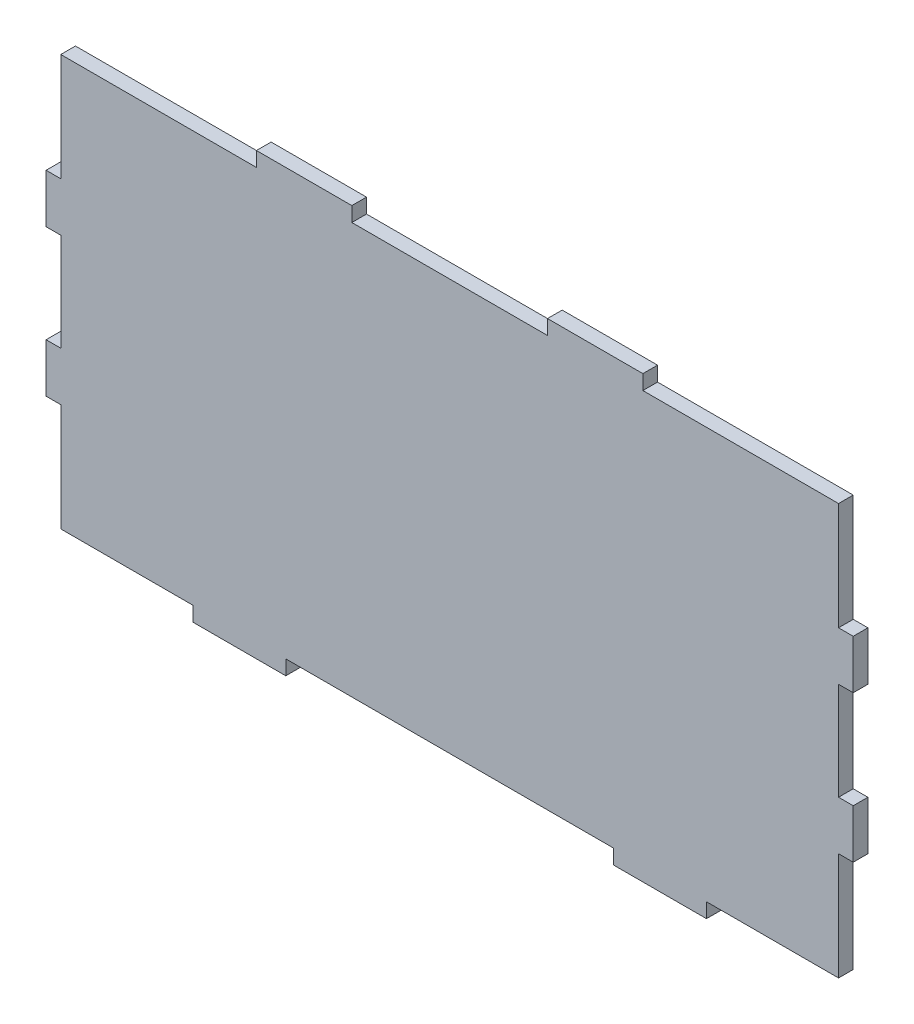
ISO-10303-21;
HEADER;
FILE_DESCRIPTION(('STEP AP214'),'2;1');
FILE_NAME('part.step','',(''),(''),'','','');
FILE_SCHEMA(('AUTOMOTIVE_DESIGN { 1 0 10303 214 1 1 1 1 }'));
ENDSEC;
DATA;
#1=APPLICATION_CONTEXT('core data for automotive mechanical design processes');
#2=APPLICATION_PROTOCOL_DEFINITION('international standard','automotive_design',2000,#1);
#3=PRODUCT_CONTEXT('',#1,'mechanical');
#4=PRODUCT('Part','Part','',(#3));
#5=PRODUCT_RELATED_PRODUCT_CATEGORY('part','',(#4));
#6=PRODUCT_DEFINITION_FORMATION('','',#4);
#7=PRODUCT_DEFINITION_CONTEXT('part definition',#1,'design');
#8=PRODUCT_DEFINITION('design','',#6,#7);
#9=PRODUCT_DEFINITION_SHAPE('','',#8);
#10=(LENGTH_UNIT() NAMED_UNIT(*) SI_UNIT(.MILLI.,.METRE.));
#11=(NAMED_UNIT(*) PLANE_ANGLE_UNIT() SI_UNIT($,.RADIAN.));
#12=(NAMED_UNIT(*) SI_UNIT($,.STERADIAN.) SOLID_ANGLE_UNIT());
#13=UNCERTAINTY_MEASURE_WITH_UNIT(LENGTH_MEASURE(1.E-05),#10,'distance_accuracy_value','');
#14=(GEOMETRIC_REPRESENTATION_CONTEXT(3) GLOBAL_UNCERTAINTY_ASSIGNED_CONTEXT((#13)) GLOBAL_UNIT_ASSIGNED_CONTEXT((#10,
#11,#12)) REPRESENTATION_CONTEXT('',''));
#15=CARTESIAN_POINT('',(0.,0.,0.));
#16=DIRECTION('',(0.,0.,1.));
#17=DIRECTION('',(1.,0.,0.));
#18=AXIS2_PLACEMENT_3D('',#15,#16,#17);
#19=CARTESIAN_POINT('',(0.,0.,6.));
#20=DIRECTION('',(0.,1.,0.));
#21=DIRECTION('',(-1.,0.,0.));
#22=AXIS2_PLACEMENT_3D('',#19,#20,#21);
#23=PLANE('',#22);
#24=DIRECTION('',(1.,0.,0.));
#25=VECTOR('',#24,1.);
#26=CARTESIAN_POINT('',(0.,0.,0.));
#27=LINE('',#26,#25);
#28=CARTESIAN_POINT('',(-270.,0.,0.));
#29=VERTEX_POINT('',#28);
#30=CARTESIAN_POINT('',(-232.,0.,0.));
#31=VERTEX_POINT('',#30);
#32=EDGE_CURVE('E37',#29,#31,#27,.T.);
#33=ORIENTED_EDGE('',*,*,#32,.T.);
#34=DIRECTION('',(0.,0.,1.));
#35=VECTOR('',#34,1.);
#36=CARTESIAN_POINT('',(-232.,0.,0.));
#37=LINE('',#36,#35);
#38=CARTESIAN_POINT('',(-232.,0.,6.));
#39=VERTEX_POINT('',#38);
#40=EDGE_CURVE('E268',#31,#39,#37,.T.);
#41=ORIENTED_EDGE('',*,*,#40,.T.);
#42=DIRECTION('',(1.,0.,0.));
#43=VECTOR('',#42,1.);
#44=CARTESIAN_POINT('',(0.,0.,6.));
#45=LINE('',#44,#43);
#46=CARTESIAN_POINT('',(-270.,0.,6.));
#47=VERTEX_POINT('',#46);
#48=EDGE_CURVE('E11',#47,#39,#45,.T.);
#49=ORIENTED_EDGE('',*,*,#48,.F.);
#50=DIRECTION('',(0.,0.,1.));
#51=VECTOR('',#50,1.);
#52=CARTESIAN_POINT('',(-270.,0.,0.));
#53=LINE('',#52,#51);
#54=EDGE_CURVE('E288',#29,#47,#53,.T.);
#55=ORIENTED_EDGE('',*,*,#54,.F.);
#56=EDGE_LOOP('',(#33,#41,#49,#55));
#57=FACE_BOUND('',#56,.T.);
#58=ADVANCED_FACE('F33',(#57),#23,.F.);
#59=CARTESIAN_POINT('',(0.,180.,6.));
#60=DIRECTION('',(0.,-1.,0.));
#61=DIRECTION('',(1.,0.,0.));
#62=AXIS2_PLACEMENT_3D('',#59,#60,#61);
#63=PLANE('',#62);
#64=DIRECTION('',(-1.,0.,0.));
#65=VECTOR('',#64,1.);
#66=CARTESIAN_POINT('',(0.,180.,6.));
#67=LINE('',#66,#65);
#68=CARTESIAN_POINT('',(-205.,180.,6.));
#69=VERTEX_POINT('',#68);
#70=CARTESIAN_POINT('',(-244.,180.,6.));
#71=VERTEX_POINT('',#70);
#72=EDGE_CURVE('E320',#69,#71,#67,.T.);
#73=ORIENTED_EDGE('',*,*,#72,.F.);
#74=DIRECTION('',(0.,0.,1.));
#75=VECTOR('',#74,1.);
#76=CARTESIAN_POINT('',(-205.,180.,0.));
#77=LINE('',#76,#75);
#78=CARTESIAN_POINT('',(-205.,180.,0.));
#79=VERTEX_POINT('',#78);
#80=EDGE_CURVE('E504',#79,#69,#77,.T.);
#81=ORIENTED_EDGE('',*,*,#80,.F.);
#82=DIRECTION('',(-1.,0.,0.));
#83=VECTOR('',#82,1.);
#84=CARTESIAN_POINT('',(0.,180.,0.));
#85=LINE('',#84,#83);
#86=CARTESIAN_POINT('',(-244.,180.,0.));
#87=VERTEX_POINT('',#86);
#88=EDGE_CURVE('E309',#79,#87,#85,.T.);
#89=ORIENTED_EDGE('',*,*,#88,.T.);
#90=DIRECTION('',(0.,0.,1.));
#91=VECTOR('',#90,1.);
#92=CARTESIAN_POINT('',(-244.,180.,0.));
#93=LINE('',#92,#91);
#94=EDGE_CURVE('E332',#87,#71,#93,.T.);
#95=ORIENTED_EDGE('',*,*,#94,.T.);
#96=EDGE_LOOP('',(#73,#81,#89,#95));
#97=FACE_BOUND('',#96,.T.);
#98=ADVANCED_FACE('F624',(#97),#63,.F.);
#99=CARTESIAN_POINT('',(0.,0.,6.));
#100=DIRECTION('',(-1.,0.,0.));
#101=DIRECTION('',(0.,0.,1.));
#102=AXIS2_PLACEMENT_3D('',#99,#100,#101);
#103=PLANE('',#102);
#104=DIRECTION('',(0.,1.,0.));
#105=VECTOR('',#104,1.);
#106=CARTESIAN_POINT('',(0.,0.,0.));
#107=LINE('',#106,#105);
#108=CARTESIAN_POINT('',(0.,50.,0.));
#109=VERTEX_POINT('',#108);
#110=CARTESIAN_POINT('',(0.,70.,0.));
#111=VERTEX_POINT('',#110);
#112=EDGE_CURVE('E310',#109,#111,#107,.T.);
#113=ORIENTED_EDGE('',*,*,#112,.T.);
#114=DIRECTION('',(0.,0.,1.));
#115=VECTOR('',#114,1.);
#116=CARTESIAN_POINT('',(0.,70.,0.));
#117=LINE('',#116,#115);
#118=CARTESIAN_POINT('',(0.,70.,6.));
#119=VERTEX_POINT('',#118);
#120=EDGE_CURVE('E475',#111,#119,#117,.T.);
#121=ORIENTED_EDGE('',*,*,#120,.T.);
#122=DIRECTION('',(0.,1.,0.));
#123=VECTOR('',#122,1.);
#124=CARTESIAN_POINT('',(0.,0.,6.));
#125=LINE('',#124,#123);
#126=CARTESIAN_POINT('',(0.,50.,6.));
#127=VERTEX_POINT('',#126);
#128=EDGE_CURVE('E291',#127,#119,#125,.T.);
#129=ORIENTED_EDGE('',*,*,#128,.F.);
#130=DIRECTION('',(0.,0.,1.));
#131=VECTOR('',#130,1.);
#132=CARTESIAN_POINT('',(0.,50.,0.));
#133=LINE('',#132,#131);
#134=EDGE_CURVE('E397',#109,#127,#133,.T.);
#135=ORIENTED_EDGE('',*,*,#134,.F.);
#136=EDGE_LOOP('',(#113,#121,#129,#135));
#137=FACE_BOUND('',#136,.T.);
#138=ADVANCED_FACE('F574',(#137),#103,.F.);
#139=CARTESIAN_POINT('',(-330.,0.,6.));
#140=DIRECTION('',(1.,0.,0.));
#141=DIRECTION('',(0.,0.,-1.));
#142=AXIS2_PLACEMENT_3D('',#139,#140,#141);
#143=PLANE('',#142);
#144=DIRECTION('',(0.,-1.,0.));
#145=VECTOR('',#144,1.);
#146=CARTESIAN_POINT('',(-330.,0.,0.));
#147=LINE('',#146,#145);
#148=CARTESIAN_POINT('',(-330.,130.,0.));
#149=VERTEX_POINT('',#148);
#150=CARTESIAN_POINT('',(-330.,110.,0.));
#151=VERTEX_POINT('',#150);
#152=EDGE_CURVE('E293',#149,#151,#147,.T.);
#153=ORIENTED_EDGE('',*,*,#152,.T.);
#154=DIRECTION('',(0.,0.,1.));
#155=VECTOR('',#154,1.);
#156=CARTESIAN_POINT('',(-330.,110.,0.));
#157=LINE('',#156,#155);
#158=CARTESIAN_POINT('',(-330.,110.,6.));
#159=VERTEX_POINT('',#158);
#160=EDGE_CURVE('E415',#151,#159,#157,.T.);
#161=ORIENTED_EDGE('',*,*,#160,.T.);
#162=DIRECTION('',(0.,-1.,0.));
#163=VECTOR('',#162,1.);
#164=CARTESIAN_POINT('',(-330.,0.,6.));
#165=LINE('',#164,#163);
#166=CARTESIAN_POINT('',(-330.,130.,6.));
#167=VERTEX_POINT('',#166);
#168=EDGE_CURVE('E314',#167,#159,#165,.T.);
#169=ORIENTED_EDGE('',*,*,#168,.F.);
#170=DIRECTION('',(0.,0.,1.));
#171=VECTOR('',#170,1.);
#172=CARTESIAN_POINT('',(-330.,130.,0.));
#173=LINE('',#172,#171);
#174=EDGE_CURVE('E323',#149,#167,#173,.T.);
#175=ORIENTED_EDGE('',*,*,#174,.F.);
#176=EDGE_LOOP('',(#153,#161,#169,#175));
#177=FACE_BOUND('',#176,.T.);
#178=ADVANCED_FACE('F641',(#177),#143,.F.);
#179=CARTESIAN_POINT('',(0.,110.,6.));
#180=VERTEX_POINT('',#179);
#181=CARTESIAN_POINT('',(0.,130.,6.));
#182=VERTEX_POINT('',#181);
#183=EDGE_CURVE('E289',#180,#182,#125,.T.);
#184=ORIENTED_EDGE('',*,*,#183,.F.);
#185=DIRECTION('',(0.,0.,1.));
#186=VECTOR('',#185,1.);
#187=CARTESIAN_POINT('',(0.,110.,0.));
#188=LINE('',#187,#186);
#189=CARTESIAN_POINT('',(0.,110.,0.));
#190=VERTEX_POINT('',#189);
#191=EDGE_CURVE('E486',#190,#180,#188,.T.);
#192=ORIENTED_EDGE('',*,*,#191,.F.);
#193=CARTESIAN_POINT('',(0.,130.,0.));
#194=VERTEX_POINT('',#193);
#195=EDGE_CURVE('E312',#190,#194,#107,.T.);
#196=ORIENTED_EDGE('',*,*,#195,.T.);
#197=DIRECTION('',(0.,0.,1.));
#198=VECTOR('',#197,1.);
#199=CARTESIAN_POINT('',(0.,130.,0.));
#200=LINE('',#199,#198);
#201=EDGE_CURVE('E443',#194,#182,#200,.T.);
#202=ORIENTED_EDGE('',*,*,#201,.T.);
#203=EDGE_LOOP('',(#184,#192,#196,#202));
#204=FACE_BOUND('',#203,.T.);
#205=ADVANCED_FACE('F35',(#204),#103,.F.);
#206=CARTESIAN_POINT('',(-86.,180.,0.));
#207=VERTEX_POINT('',#206);
#208=CARTESIAN_POINT('',(-125.,180.,0.));
#209=VERTEX_POINT('',#208);
#210=EDGE_CURVE('E305',#207,#209,#85,.T.);
#211=ORIENTED_EDGE('',*,*,#210,.T.);
#212=DIRECTION('',(0.,0.,1.));
#213=VECTOR('',#212,1.);
#214=CARTESIAN_POINT('',(-125.,180.,0.));
#215=LINE('',#214,#213);
#216=CARTESIAN_POINT('',(-125.,180.,6.));
#217=VERTEX_POINT('',#216);
#218=EDGE_CURVE('E516',#209,#217,#215,.T.);
#219=ORIENTED_EDGE('',*,*,#218,.T.);
#220=CARTESIAN_POINT('',(-86.,180.,6.));
#221=VERTEX_POINT('',#220);
#222=EDGE_CURVE('E318',#221,#217,#67,.T.);
#223=ORIENTED_EDGE('',*,*,#222,.F.);
#224=DIRECTION('',(0.,0.,1.));
#225=VECTOR('',#224,1.);
#226=CARTESIAN_POINT('',(-86.,180.,0.));
#227=LINE('',#226,#225);
#228=EDGE_CURVE('E451',#207,#221,#227,.T.);
#229=ORIENTED_EDGE('',*,*,#228,.F.);
#230=EDGE_LOOP('',(#211,#219,#223,#229));
#231=FACE_BOUND('',#230,.T.);
#232=ADVANCED_FACE('F610',(#231),#63,.F.);
#233=CARTESIAN_POINT('',(-330.,70.,6.));
#234=VERTEX_POINT('',#233);
#235=CARTESIAN_POINT('',(-330.,50.,6.));
#236=VERTEX_POINT('',#235);
#237=EDGE_CURVE('E317',#234,#236,#165,.T.);
#238=ORIENTED_EDGE('',*,*,#237,.F.);
#239=DIRECTION('',(0.,0.,1.));
#240=VECTOR('',#239,1.);
#241=CARTESIAN_POINT('',(-330.,70.,0.));
#242=LINE('',#241,#240);
#243=CARTESIAN_POINT('',(-330.,70.,0.));
#244=VERTEX_POINT('',#243);
#245=EDGE_CURVE('E426',#244,#234,#242,.T.);
#246=ORIENTED_EDGE('',*,*,#245,.F.);
#247=CARTESIAN_POINT('',(-330.,50.,0.));
#248=VERTEX_POINT('',#247);
#249=EDGE_CURVE('E300',#244,#248,#147,.T.);
#250=ORIENTED_EDGE('',*,*,#249,.T.);
#251=DIRECTION('',(0.,0.,1.));
#252=VECTOR('',#251,1.);
#253=CARTESIAN_POINT('',(-330.,50.,0.));
#254=LINE('',#253,#252);
#255=EDGE_CURVE('E364',#248,#236,#254,.T.);
#256=ORIENTED_EDGE('',*,*,#255,.T.);
#257=EDGE_LOOP('',(#238,#246,#250,#256));
#258=FACE_BOUND('',#257,.T.);
#259=ADVANCED_FACE('F657',(#258),#143,.F.);
#260=CARTESIAN_POINT('',(-98.,0.,6.));
#261=VERTEX_POINT('',#260);
#262=CARTESIAN_POINT('',(-60.,0.,6.));
#263=VERTEX_POINT('',#262);
#264=EDGE_CURVE('E42',#261,#263,#45,.T.);
#265=ORIENTED_EDGE('',*,*,#264,.F.);
#266=DIRECTION('',(0.,0.,1.));
#267=VECTOR('',#266,1.);
#268=CARTESIAN_POINT('',(-98.,0.,0.));
#269=LINE('',#268,#267);
#270=CARTESIAN_POINT('',(-98.,0.,0.));
#271=VERTEX_POINT('',#270);
#272=EDGE_CURVE('E277',#271,#261,#269,.T.);
#273=ORIENTED_EDGE('',*,*,#272,.F.);
#274=CARTESIAN_POINT('',(-60.,0.,0.));
#275=VERTEX_POINT('',#274);
#276=EDGE_CURVE('E290',#271,#275,#27,.T.);
#277=ORIENTED_EDGE('',*,*,#276,.T.);
#278=DIRECTION('',(0.,0.,1.));
#279=VECTOR('',#278,1.);
#280=CARTESIAN_POINT('',(-60.,0.,0.));
#281=LINE('',#280,#279);
#282=EDGE_CURVE('E394',#275,#263,#281,.T.);
#283=ORIENTED_EDGE('',*,*,#282,.T.);
#284=EDGE_LOOP('',(#265,#273,#277,#283));
#285=FACE_BOUND('',#284,.T.);
#286=ADVANCED_FACE('F551',(#285),#23,.F.);
#287=CARTESIAN_POINT('',(0.,0.,6.));
#288=DIRECTION('',(0.,0.,1.));
#289=DIRECTION('',(1.,0.,0.));
#290=AXIS2_PLACEMENT_3D('',#287,#288,#289);
#291=PLANE('',#290);
#292=DIRECTION('',(0.,-1.,0.));
#293=VECTOR('',#292,1.);
#294=CARTESIAN_POINT('',(-232.,0.,6.));
#295=LINE('',#294,#293);
#296=CARTESIAN_POINT('',(-232.,5.99999999999995,6.));
#297=VERTEX_POINT('',#296);
#298=EDGE_CURVE('E273',#297,#39,#295,.T.);
#299=ORIENTED_EDGE('',*,*,#298,.F.);
#300=DIRECTION('',(-1.,0.,0.));
#301=VECTOR('',#300,1.);
#302=CARTESIAN_POINT('',(-232.,5.99999999999995,6.));
#303=LINE('',#302,#301);
#304=CARTESIAN_POINT('',(-98.,5.99999999999995,6.));
#305=VERTEX_POINT('',#304);
#306=EDGE_CURVE('E285',#305,#297,#303,.T.);
#307=ORIENTED_EDGE('',*,*,#306,.F.);
#308=DIRECTION('',(0.,1.,0.));
#309=VECTOR('',#308,1.);
#310=CARTESIAN_POINT('',(-98.,0.,6.));
#311=LINE('',#310,#309);
#312=EDGE_CURVE('E542',#261,#305,#311,.T.);
#313=ORIENTED_EDGE('',*,*,#312,.F.);
#314=ORIENTED_EDGE('',*,*,#264,.T.);
#315=DIRECTION('',(0.,-1.,0.));
#316=VECTOR('',#315,1.);
#317=CARTESIAN_POINT('',(-60.,0.,6.));
#318=LINE('',#317,#316);
#319=CARTESIAN_POINT('',(-60.,5.99999999999999,6.));
#320=VERTEX_POINT('',#319);
#321=EDGE_CURVE('E409',#320,#263,#318,.T.);
#322=ORIENTED_EDGE('',*,*,#321,.F.);
#323=DIRECTION('',(-1.,0.,0.));
#324=VECTOR('',#323,1.);
#325=CARTESIAN_POINT('',(-6.,6.,6.));
#326=LINE('',#325,#324);
#327=CARTESIAN_POINT('',(-6.,6.,6.));
#328=VERTEX_POINT('',#327);
#329=EDGE_CURVE('E412',#328,#320,#326,.T.);
#330=ORIENTED_EDGE('',*,*,#329,.F.);
#331=DIRECTION('',(0.,-1.,0.));
#332=VECTOR('',#331,1.);
#333=CARTESIAN_POINT('',(-6.,6.,6.));
#334=LINE('',#333,#332);
#335=CARTESIAN_POINT('',(-6.,50.,6.));
#336=VERTEX_POINT('',#335);
#337=EDGE_CURVE('E402',#336,#328,#334,.T.);
#338=ORIENTED_EDGE('',*,*,#337,.F.);
#339=DIRECTION('',(-1.,0.,0.));
#340=VECTOR('',#339,1.);
#341=CARTESIAN_POINT('',(0.,50.,6.));
#342=LINE('',#341,#340);
#343=EDGE_CURVE('E406',#127,#336,#342,.T.);
#344=ORIENTED_EDGE('',*,*,#343,.F.);
#345=ORIENTED_EDGE('',*,*,#128,.T.);
#346=DIRECTION('',(1.,0.,0.));
#347=VECTOR('',#346,1.);
#348=CARTESIAN_POINT('',(0.,70.,6.));
#349=LINE('',#348,#347);
#350=CARTESIAN_POINT('',(-6.00000000000005,70.,6.));
#351=VERTEX_POINT('',#350);
#352=EDGE_CURVE('E495',#351,#119,#349,.T.);
#353=ORIENTED_EDGE('',*,*,#352,.F.);
#354=DIRECTION('',(0.,-1.,0.));
#355=VECTOR('',#354,1.);
#356=CARTESIAN_POINT('',(-6.00000000000005,70.,6.));
#357=LINE('',#356,#355);
#358=CARTESIAN_POINT('',(-6.00000000000005,110.,6.));
#359=VERTEX_POINT('',#358);
#360=EDGE_CURVE('E498',#359,#351,#357,.T.);
#361=ORIENTED_EDGE('',*,*,#360,.F.);
#362=DIRECTION('',(-1.,0.,0.));
#363=VECTOR('',#362,1.);
#364=CARTESIAN_POINT('',(0.,110.,6.));
#365=LINE('',#364,#363);
#366=EDGE_CURVE('E501',#180,#359,#365,.T.);
#367=ORIENTED_EDGE('',*,*,#366,.F.);
#368=ORIENTED_EDGE('',*,*,#183,.T.);
#369=DIRECTION('',(1.,0.,0.));
#370=VECTOR('',#369,1.);
#371=CARTESIAN_POINT('',(0.,130.,6.));
#372=LINE('',#371,#370);
#373=CARTESIAN_POINT('',(-5.99999999999999,130.,6.));
#374=VERTEX_POINT('',#373);
#375=EDGE_CURVE('E462',#374,#182,#372,.T.);
#376=ORIENTED_EDGE('',*,*,#375,.F.);
#377=DIRECTION('',(0.,-1.,0.));
#378=VECTOR('',#377,1.);
#379=CARTESIAN_POINT('',(-6.,174.,6.));
#380=LINE('',#379,#378);
#381=CARTESIAN_POINT('',(-6.,174.,6.));
#382=VERTEX_POINT('',#381);
#383=EDGE_CURVE('E466',#382,#374,#380,.T.);
#384=ORIENTED_EDGE('',*,*,#383,.F.);
#385=DIRECTION('',(1.,0.,0.));
#386=VECTOR('',#385,1.);
#387=CARTESIAN_POINT('',(-6.,174.,6.));
#388=LINE('',#387,#386);
#389=CARTESIAN_POINT('',(-86.,174.,6.));
#390=VERTEX_POINT('',#389);
#391=EDGE_CURVE('E469',#390,#382,#388,.T.);
#392=ORIENTED_EDGE('',*,*,#391,.F.);
#393=DIRECTION('',(0.,-1.,0.));
#394=VECTOR('',#393,1.);
#395=CARTESIAN_POINT('',(-86.,180.,6.));
#396=LINE('',#395,#394);
#397=EDGE_CURVE('E472',#221,#390,#396,.T.);
#398=ORIENTED_EDGE('',*,*,#397,.F.);
#399=ORIENTED_EDGE('',*,*,#222,.T.);
#400=DIRECTION('',(0.,1.,0.));
#401=VECTOR('',#400,1.);
#402=CARTESIAN_POINT('',(-125.,180.,6.));
#403=LINE('',#402,#401);
#404=CARTESIAN_POINT('',(-125.,174.,6.));
#405=VERTEX_POINT('',#404);
#406=EDGE_CURVE('E520',#405,#217,#403,.T.);
#407=ORIENTED_EDGE('',*,*,#406,.F.);
#408=DIRECTION('',(1.,0.,0.));
#409=VECTOR('',#408,1.);
#410=CARTESIAN_POINT('',(-205.,174.,6.));
#411=LINE('',#410,#409);
#412=CARTESIAN_POINT('',(-205.,174.,6.));
#413=VERTEX_POINT('',#412);
#414=EDGE_CURVE('E523',#413,#405,#411,.T.);
#415=ORIENTED_EDGE('',*,*,#414,.F.);
#416=DIRECTION('',(0.,-1.,0.));
#417=VECTOR('',#416,1.);
#418=CARTESIAN_POINT('',(-205.,180.,6.));
#419=LINE('',#418,#417);
#420=EDGE_CURVE('E526',#69,#413,#419,.T.);
#421=ORIENTED_EDGE('',*,*,#420,.F.);
#422=ORIENTED_EDGE('',*,*,#72,.T.);
#423=DIRECTION('',(0.,1.,0.));
#424=VECTOR('',#423,1.);
#425=CARTESIAN_POINT('',(-244.,180.,6.));
#426=LINE('',#425,#424);
#427=CARTESIAN_POINT('',(-244.,174.,6.));
#428=VERTEX_POINT('',#427);
#429=EDGE_CURVE('E335',#428,#71,#426,.T.);
#430=ORIENTED_EDGE('',*,*,#429,.F.);
#431=DIRECTION('',(1.,0.,0.));
#432=VECTOR('',#431,1.);
#433=CARTESIAN_POINT('',(-324.,174.,6.));
#434=LINE('',#433,#432);
#435=CARTESIAN_POINT('',(-324.,174.,6.));
#436=VERTEX_POINT('',#435);
#437=EDGE_CURVE('E339',#436,#428,#434,.T.);
#438=ORIENTED_EDGE('',*,*,#437,.F.);
#439=DIRECTION('',(0.,1.,0.));
#440=VECTOR('',#439,1.);
#441=CARTESIAN_POINT('',(-324.,174.,6.));
#442=LINE('',#441,#440);
#443=CARTESIAN_POINT('',(-324.,130.,6.));
#444=VERTEX_POINT('',#443);
#445=EDGE_CURVE('E342',#444,#436,#442,.T.);
#446=ORIENTED_EDGE('',*,*,#445,.F.);
#447=DIRECTION('',(1.,0.,0.));
#448=VECTOR('',#447,1.);
#449=CARTESIAN_POINT('',(-330.,130.,6.));
#450=LINE('',#449,#448);
#451=EDGE_CURVE('E345',#167,#444,#450,.T.);
#452=ORIENTED_EDGE('',*,*,#451,.F.);
#453=ORIENTED_EDGE('',*,*,#168,.T.);
#454=DIRECTION('',(-1.,0.,0.));
#455=VECTOR('',#454,1.);
#456=CARTESIAN_POINT('',(-330.,110.,6.));
#457=LINE('',#456,#455);
#458=CARTESIAN_POINT('',(-324.,110.,6.));
#459=VERTEX_POINT('',#458);
#460=EDGE_CURVE('E434',#459,#159,#457,.T.);
#461=ORIENTED_EDGE('',*,*,#460,.F.);
#462=DIRECTION('',(0.,1.,0.));
#463=VECTOR('',#462,1.);
#464=CARTESIAN_POINT('',(-324.,70.,6.));
#465=LINE('',#464,#463);
#466=CARTESIAN_POINT('',(-324.,70.,6.));
#467=VERTEX_POINT('',#466);
#468=EDGE_CURVE('E437',#467,#459,#465,.T.);
#469=ORIENTED_EDGE('',*,*,#468,.F.);
#470=DIRECTION('',(1.,0.,0.));
#471=VECTOR('',#470,1.);
#472=CARTESIAN_POINT('',(-330.,70.,6.));
#473=LINE('',#472,#471);
#474=EDGE_CURVE('E440',#234,#467,#473,.T.);
#475=ORIENTED_EDGE('',*,*,#474,.F.);
#476=ORIENTED_EDGE('',*,*,#237,.T.);
#477=DIRECTION('',(-1.,0.,0.));
#478=VECTOR('',#477,1.);
#479=CARTESIAN_POINT('',(-330.,50.,6.));
#480=LINE('',#479,#478);
#481=CARTESIAN_POINT('',(-324.,50.,6.));
#482=VERTEX_POINT('',#481);
#483=EDGE_CURVE('E373',#482,#236,#480,.T.);
#484=ORIENTED_EDGE('',*,*,#483,.F.);
#485=DIRECTION('',(0.,1.,0.));
#486=VECTOR('',#485,1.);
#487=CARTESIAN_POINT('',(-324.,6.,6.));
#488=LINE('',#487,#486);
#489=CARTESIAN_POINT('',(-324.,6.,6.));
#490=VERTEX_POINT('',#489);
#491=EDGE_CURVE('E376',#490,#482,#488,.T.);
#492=ORIENTED_EDGE('',*,*,#491,.F.);
#493=DIRECTION('',(-1.,0.,0.));
#494=VECTOR('',#493,1.);
#495=CARTESIAN_POINT('',(-324.,6.,6.));
#496=LINE('',#495,#494);
#497=CARTESIAN_POINT('',(-270.,5.9999999999999,6.));
#498=VERTEX_POINT('',#497);
#499=EDGE_CURVE('E379',#498,#490,#496,.T.);
#500=ORIENTED_EDGE('',*,*,#499,.F.);
#501=DIRECTION('',(0.,1.,0.));
#502=VECTOR('',#501,1.);
#503=CARTESIAN_POINT('',(-270.,0.,6.));
#504=LINE('',#503,#502);
#505=EDGE_CURVE('E369',#47,#498,#504,.T.);
#506=ORIENTED_EDGE('',*,*,#505,.F.);
#507=ORIENTED_EDGE('',*,*,#48,.T.);
#508=EDGE_LOOP('',(#299,#307,#313,#314,#322,#330,#338,#344,#345,#353,#361,#367,#368,#376,#384,
#392,#398,#399,#407,#415,#421,#422,#430,#438,#446,#452,#453,#461,#469,#475,#476,#484,#492,#500,
#506,#507));
#509=FACE_BOUND('',#508,.T.);
#510=ADVANCED_FACE('F554',(#509),#291,.T.);
#511=CARTESIAN_POINT('',(0.,0.,0.));
#512=DIRECTION('',(0.,0.,1.));
#513=DIRECTION('',(1.,0.,0.));
#514=AXIS2_PLACEMENT_3D('',#511,#512,#513);
#515=PLANE('',#514);
#516=DIRECTION('',(-1.,0.,0.));
#517=VECTOR('',#516,1.);
#518=CARTESIAN_POINT('',(-232.,5.99999999999995,0.));
#519=LINE('',#518,#517);
#520=CARTESIAN_POINT('',(-98.,5.99999999999995,0.));
#521=VERTEX_POINT('',#520);
#522=CARTESIAN_POINT('',(-232.,5.99999999999995,0.));
#523=VERTEX_POINT('',#522);
#524=EDGE_CURVE('E50',#521,#523,#519,.T.);
#525=ORIENTED_EDGE('',*,*,#524,.T.);
#526=DIRECTION('',(0.,-1.,0.));
#527=VECTOR('',#526,1.);
#528=CARTESIAN_POINT('',(-232.,0.,0.));
#529=LINE('',#528,#527);
#530=EDGE_CURVE('E271',#523,#31,#529,.T.);
#531=ORIENTED_EDGE('',*,*,#530,.T.);
#532=ORIENTED_EDGE('',*,*,#32,.F.);
#533=DIRECTION('',(0.,1.,0.));
#534=VECTOR('',#533,1.);
#535=CARTESIAN_POINT('',(-270.,0.,0.));
#536=LINE('',#535,#534);
#537=CARTESIAN_POINT('',(-270.,5.9999999999999,0.));
#538=VERTEX_POINT('',#537);
#539=EDGE_CURVE('E362',#29,#538,#536,.T.);
#540=ORIENTED_EDGE('',*,*,#539,.T.);
#541=DIRECTION('',(-1.,0.,0.));
#542=VECTOR('',#541,1.);
#543=CARTESIAN_POINT('',(-324.,6.,0.));
#544=LINE('',#543,#542);
#545=CARTESIAN_POINT('',(-324.,6.,0.));
#546=VERTEX_POINT('',#545);
#547=EDGE_CURVE('E372',#538,#546,#544,.T.);
#548=ORIENTED_EDGE('',*,*,#547,.T.);
#549=DIRECTION('',(0.,1.,0.));
#550=VECTOR('',#549,1.);
#551=CARTESIAN_POINT('',(-324.,6.,0.));
#552=LINE('',#551,#550);
#553=CARTESIAN_POINT('',(-324.,50.,0.));
#554=VERTEX_POINT('',#553);
#555=EDGE_CURVE('E387',#546,#554,#552,.T.);
#556=ORIENTED_EDGE('',*,*,#555,.T.);
#557=DIRECTION('',(-1.,0.,0.));
#558=VECTOR('',#557,1.);
#559=CARTESIAN_POINT('',(-330.,50.,0.));
#560=LINE('',#559,#558);
#561=EDGE_CURVE('E384',#554,#248,#560,.T.);
#562=ORIENTED_EDGE('',*,*,#561,.T.);
#563=ORIENTED_EDGE('',*,*,#249,.F.);
#564=DIRECTION('',(1.,0.,0.));
#565=VECTOR('',#564,1.);
#566=CARTESIAN_POINT('',(-330.,70.,0.));
#567=LINE('',#566,#565);
#568=CARTESIAN_POINT('',(-324.,70.,0.));
#569=VERTEX_POINT('',#568);
#570=EDGE_CURVE('E436',#244,#569,#567,.T.);
#571=ORIENTED_EDGE('',*,*,#570,.T.);
#572=DIRECTION('',(0.,1.,0.));
#573=VECTOR('',#572,1.);
#574=CARTESIAN_POINT('',(-324.,70.,0.));
#575=LINE('',#574,#573);
#576=CARTESIAN_POINT('',(-324.,110.,0.));
#577=VERTEX_POINT('',#576);
#578=EDGE_CURVE('E446',#569,#577,#575,.T.);
#579=ORIENTED_EDGE('',*,*,#578,.T.);
#580=DIRECTION('',(-1.,0.,0.));
#581=VECTOR('',#580,1.);
#582=CARTESIAN_POINT('',(-330.,110.,0.));
#583=LINE('',#582,#581);
#584=EDGE_CURVE('E429',#577,#151,#583,.T.);
#585=ORIENTED_EDGE('',*,*,#584,.T.);
#586=ORIENTED_EDGE('',*,*,#152,.F.);
#587=DIRECTION('',(1.,0.,0.));
#588=VECTOR('',#587,1.);
#589=CARTESIAN_POINT('',(-330.,130.,0.));
#590=LINE('',#589,#588);
#591=CARTESIAN_POINT('',(-324.,130.,0.));
#592=VERTEX_POINT('',#591);
#593=EDGE_CURVE('E338',#149,#592,#590,.T.);
#594=ORIENTED_EDGE('',*,*,#593,.T.);
#595=DIRECTION('',(0.,1.,0.));
#596=VECTOR('',#595,1.);
#597=CARTESIAN_POINT('',(-324.,174.,0.));
#598=LINE('',#597,#596);
#599=CARTESIAN_POINT('',(-324.,174.,0.));
#600=VERTEX_POINT('',#599);
#601=EDGE_CURVE('E354',#592,#600,#598,.T.);
#602=ORIENTED_EDGE('',*,*,#601,.T.);
#603=DIRECTION('',(1.,0.,0.));
#604=VECTOR('',#603,1.);
#605=CARTESIAN_POINT('',(-324.,174.,0.));
#606=LINE('',#605,#604);
#607=CARTESIAN_POINT('',(-244.,174.,0.));
#608=VERTEX_POINT('',#607);
#609=EDGE_CURVE('E351',#600,#608,#606,.T.);
#610=ORIENTED_EDGE('',*,*,#609,.T.);
#611=DIRECTION('',(0.,1.,0.));
#612=VECTOR('',#611,1.);
#613=CARTESIAN_POINT('',(-244.,180.,0.));
#614=LINE('',#613,#612);
#615=EDGE_CURVE('E326',#608,#87,#614,.T.);
#616=ORIENTED_EDGE('',*,*,#615,.T.);
#617=ORIENTED_EDGE('',*,*,#88,.F.);
#618=DIRECTION('',(0.,-1.,0.));
#619=VECTOR('',#618,1.);
#620=CARTESIAN_POINT('',(-205.,180.,0.));
#621=LINE('',#620,#619);
#622=CARTESIAN_POINT('',(-205.,174.,0.));
#623=VERTEX_POINT('',#622);
#624=EDGE_CURVE('E522',#79,#623,#621,.T.);
#625=ORIENTED_EDGE('',*,*,#624,.T.);
#626=DIRECTION('',(1.,0.,0.));
#627=VECTOR('',#626,1.);
#628=CARTESIAN_POINT('',(-205.,174.,0.));
#629=LINE('',#628,#627);
#630=CARTESIAN_POINT('',(-125.,174.,0.));
#631=VERTEX_POINT('',#630);
#632=EDGE_CURVE('E531',#623,#631,#629,.T.);
#633=ORIENTED_EDGE('',*,*,#632,.T.);
#634=DIRECTION('',(0.,1.,0.));
#635=VECTOR('',#634,1.);
#636=CARTESIAN_POINT('',(-125.,180.,0.));
#637=LINE('',#636,#635);
#638=EDGE_CURVE('E58',#631,#209,#637,.T.);
#639=ORIENTED_EDGE('',*,*,#638,.T.);
#640=ORIENTED_EDGE('',*,*,#210,.F.);
#641=DIRECTION('',(0.,-1.,0.));
#642=VECTOR('',#641,1.);
#643=CARTESIAN_POINT('',(-86.,180.,0.));
#644=LINE('',#643,#642);
#645=CARTESIAN_POINT('',(-86.,174.,0.));
#646=VERTEX_POINT('',#645);
#647=EDGE_CURVE('E465',#207,#646,#644,.T.);
#648=ORIENTED_EDGE('',*,*,#647,.T.);
#649=DIRECTION('',(1.,0.,0.));
#650=VECTOR('',#649,1.);
#651=CARTESIAN_POINT('',(-6.,174.,0.));
#652=LINE('',#651,#650);
#653=CARTESIAN_POINT('',(-6.,174.,0.));
#654=VERTEX_POINT('',#653);
#655=EDGE_CURVE('E481',#646,#654,#652,.T.);
#656=ORIENTED_EDGE('',*,*,#655,.T.);
#657=DIRECTION('',(0.,-1.,0.));
#658=VECTOR('',#657,1.);
#659=CARTESIAN_POINT('',(-6.,174.,0.));
#660=LINE('',#659,#658);
#661=CARTESIAN_POINT('',(-5.99999999999999,130.,0.));
#662=VERTEX_POINT('',#661);
#663=EDGE_CURVE('E478',#654,#662,#660,.T.);
#664=ORIENTED_EDGE('',*,*,#663,.T.);
#665=DIRECTION('',(1.,0.,0.));
#666=VECTOR('',#665,1.);
#667=CARTESIAN_POINT('',(0.,130.,0.));
#668=LINE('',#667,#666);
#669=EDGE_CURVE('E454',#662,#194,#668,.T.);
#670=ORIENTED_EDGE('',*,*,#669,.T.);
#671=ORIENTED_EDGE('',*,*,#195,.F.);
#672=DIRECTION('',(-1.,0.,0.));
#673=VECTOR('',#672,1.);
#674=CARTESIAN_POINT('',(0.,110.,0.));
#675=LINE('',#674,#673);
#676=CARTESIAN_POINT('',(-6.00000000000005,110.,0.));
#677=VERTEX_POINT('',#676);
#678=EDGE_CURVE('E497',#190,#677,#675,.T.);
#679=ORIENTED_EDGE('',*,*,#678,.T.);
#680=DIRECTION('',(0.,-1.,0.));
#681=VECTOR('',#680,1.);
#682=CARTESIAN_POINT('',(-6.00000000000005,70.,0.));
#683=LINE('',#682,#681);
#684=CARTESIAN_POINT('',(-6.00000000000005,70.,0.));
#685=VERTEX_POINT('',#684);
#686=EDGE_CURVE('E507',#677,#685,#683,.T.);
#687=ORIENTED_EDGE('',*,*,#686,.T.);
#688=DIRECTION('',(1.,0.,0.));
#689=VECTOR('',#688,1.);
#690=CARTESIAN_POINT('',(0.,70.,0.));
#691=LINE('',#690,#689);
#692=EDGE_CURVE('E489',#685,#111,#691,.T.);
#693=ORIENTED_EDGE('',*,*,#692,.T.);
#694=ORIENTED_EDGE('',*,*,#112,.F.);
#695=DIRECTION('',(-1.,0.,0.));
#696=VECTOR('',#695,1.);
#697=CARTESIAN_POINT('',(0.,50.,0.));
#698=LINE('',#697,#696);
#699=CARTESIAN_POINT('',(-6.,50.,0.));
#700=VERTEX_POINT('',#699);
#701=EDGE_CURVE('E418',#109,#700,#698,.T.);
#702=ORIENTED_EDGE('',*,*,#701,.T.);
#703=DIRECTION('',(0.,-1.,0.));
#704=VECTOR('',#703,1.);
#705=CARTESIAN_POINT('',(-6.,6.,0.));
#706=LINE('',#705,#704);
#707=CARTESIAN_POINT('',(-6.,6.,0.));
#708=VERTEX_POINT('',#707);
#709=EDGE_CURVE('E395',#700,#708,#706,.T.);
#710=ORIENTED_EDGE('',*,*,#709,.T.);
#711=DIRECTION('',(-1.,0.,0.));
#712=VECTOR('',#711,1.);
#713=CARTESIAN_POINT('',(-6.,6.,0.));
#714=LINE('',#713,#712);
#715=CARTESIAN_POINT('',(-60.,5.99999999999999,0.));
#716=VERTEX_POINT('',#715);
#717=EDGE_CURVE('E405',#708,#716,#714,.T.);
#718=ORIENTED_EDGE('',*,*,#717,.T.);
#719=DIRECTION('',(0.,-1.,0.));
#720=VECTOR('',#719,1.);
#721=CARTESIAN_POINT('',(-60.,0.,0.));
#722=LINE('',#721,#720);
#723=EDGE_CURVE('E421',#716,#275,#722,.T.);
#724=ORIENTED_EDGE('',*,*,#723,.T.);
#725=ORIENTED_EDGE('',*,*,#276,.F.);
#726=DIRECTION('',(0.,1.,0.));
#727=VECTOR('',#726,1.);
#728=CARTESIAN_POINT('',(-98.,0.,0.));
#729=LINE('',#728,#727);
#730=EDGE_CURVE('E284',#271,#521,#729,.T.);
#731=ORIENTED_EDGE('',*,*,#730,.T.);
#732=EDGE_LOOP('',(#525,#531,#532,#540,#548,#556,#562,#563,#571,#579,#585,#586,#594,#602,#610,
#616,#617,#625,#633,#639,#640,#648,#656,#664,#670,#671,#679,#687,#693,#694,#702,#710,#718,#724,
#725,#731));
#733=FACE_BOUND('',#732,.T.);
#734=ADVANCED_FACE('F281',(#733),#515,.F.);
#735=CARTESIAN_POINT('',(-244.,180.,0.));
#736=DIRECTION('',(1.,0.,0.));
#737=DIRECTION('',(0.,1.,0.));
#738=AXIS2_PLACEMENT_3D('',#735,#736,#737);
#739=PLANE('',#738);
#740=ORIENTED_EDGE('',*,*,#429,.T.);
#741=ORIENTED_EDGE('',*,*,#94,.F.);
#742=ORIENTED_EDGE('',*,*,#615,.F.);
#743=DIRECTION('',(0.,0.,1.));
#744=VECTOR('',#743,1.);
#745=CARTESIAN_POINT('',(-244.,174.,0.));
#746=LINE('',#745,#744);
#747=EDGE_CURVE('E330',#608,#428,#746,.T.);
#748=ORIENTED_EDGE('',*,*,#747,.T.);
#749=EDGE_LOOP('',(#740,#741,#742,#748));
#750=FACE_BOUND('',#749,.T.);
#751=ADVANCED_FACE('F628',(#750),#739,.F.);
#752=CARTESIAN_POINT('',(-324.,174.,0.));
#753=DIRECTION('',(0.,-1.,0.));
#754=DIRECTION('',(0.,0.,-1.));
#755=AXIS2_PLACEMENT_3D('',#752,#753,#754);
#756=PLANE('',#755);
#757=ORIENTED_EDGE('',*,*,#437,.T.);
#758=ORIENTED_EDGE('',*,*,#747,.F.);
#759=ORIENTED_EDGE('',*,*,#609,.F.);
#760=DIRECTION('',(0.,0.,1.));
#761=VECTOR('',#760,1.);
#762=CARTESIAN_POINT('',(-324.,174.,0.));
#763=LINE('',#762,#761);
#764=EDGE_CURVE('E328',#600,#436,#763,.T.);
#765=ORIENTED_EDGE('',*,*,#764,.T.);
#766=EDGE_LOOP('',(#757,#758,#759,#765));
#767=FACE_BOUND('',#766,.T.);
#768=ADVANCED_FACE('F631',(#767),#756,.F.);
#769=CARTESIAN_POINT('',(-324.,174.,0.));
#770=DIRECTION('',(1.,0.,0.));
#771=DIRECTION('',(0.,1.,0.));
#772=AXIS2_PLACEMENT_3D('',#769,#770,#771);
#773=PLANE('',#772);
#774=ORIENTED_EDGE('',*,*,#445,.T.);
#775=ORIENTED_EDGE('',*,*,#764,.F.);
#776=ORIENTED_EDGE('',*,*,#601,.F.);
#777=DIRECTION('',(0.,0.,1.));
#778=VECTOR('',#777,1.);
#779=CARTESIAN_POINT('',(-324.,130.,0.));
#780=LINE('',#779,#778);
#781=EDGE_CURVE('E325',#592,#444,#780,.T.);
#782=ORIENTED_EDGE('',*,*,#781,.T.);
#783=EDGE_LOOP('',(#774,#775,#776,#782));
#784=FACE_BOUND('',#783,.T.);
#785=ADVANCED_FACE('F637',(#784),#773,.F.);
#786=CARTESIAN_POINT('',(-330.,130.,0.));
#787=DIRECTION('',(0.,-1.,0.));
#788=DIRECTION('',(1.,0.,0.));
#789=AXIS2_PLACEMENT_3D('',#786,#787,#788);
#790=PLANE('',#789);
#791=ORIENTED_EDGE('',*,*,#451,.T.);
#792=ORIENTED_EDGE('',*,*,#781,.F.);
#793=ORIENTED_EDGE('',*,*,#593,.F.);
#794=ORIENTED_EDGE('',*,*,#174,.T.);
#795=EDGE_LOOP('',(#791,#792,#793,#794));
#796=FACE_BOUND('',#795,.T.);
#797=ADVANCED_FACE('F640',(#796),#790,.F.);
#798=CARTESIAN_POINT('',(-324.,6.,0.));
#799=DIRECTION('',(0.,1.,0.));
#800=DIRECTION('',(-1.,0.,0.));
#801=AXIS2_PLACEMENT_3D('',#798,#799,#800);
#802=PLANE('',#801);
#803=ORIENTED_EDGE('',*,*,#499,.T.);
#804=DIRECTION('',(0.,0.,1.));
#805=VECTOR('',#804,1.);
#806=CARTESIAN_POINT('',(-324.,6.,0.));
#807=LINE('',#806,#805);
#808=EDGE_CURVE('E359',#546,#490,#807,.T.);
#809=ORIENTED_EDGE('',*,*,#808,.F.);
#810=ORIENTED_EDGE('',*,*,#547,.F.);
#811=DIRECTION('',(0.,0.,1.));
#812=VECTOR('',#811,1.);
#813=CARTESIAN_POINT('',(-270.,5.9999999999999,0.));
#814=LINE('',#813,#812);
#815=EDGE_CURVE('E348',#538,#498,#814,.T.);
#816=ORIENTED_EDGE('',*,*,#815,.T.);
#817=EDGE_LOOP('',(#803,#809,#810,#816));
#818=FACE_BOUND('',#817,.T.);
#819=ADVANCED_FACE('F670',(#818),#802,.F.);
#820=CARTESIAN_POINT('',(-270.,0.,0.));
#821=DIRECTION('',(1.,0.,0.));
#822=DIRECTION('',(0.,0.,-1.));
#823=AXIS2_PLACEMENT_3D('',#820,#821,#822);
#824=PLANE('',#823);
#825=ORIENTED_EDGE('',*,*,#505,.T.);
#826=ORIENTED_EDGE('',*,*,#815,.F.);
#827=ORIENTED_EDGE('',*,*,#539,.F.);
#828=ORIENTED_EDGE('',*,*,#54,.T.);
#829=EDGE_LOOP('',(#825,#826,#827,#828));
#830=FACE_BOUND('',#829,.T.);
#831=ADVANCED_FACE('F673',(#830),#824,.F.);
#832=CARTESIAN_POINT('',(-330.,50.,0.));
#833=DIRECTION('',(0.,1.,0.));
#834=DIRECTION('',(-1.,0.,0.));
#835=AXIS2_PLACEMENT_3D('',#832,#833,#834);
#836=PLANE('',#835);
#837=ORIENTED_EDGE('',*,*,#483,.T.);
#838=ORIENTED_EDGE('',*,*,#255,.F.);
#839=ORIENTED_EDGE('',*,*,#561,.F.);
#840=DIRECTION('',(0.,0.,1.));
#841=VECTOR('',#840,1.);
#842=CARTESIAN_POINT('',(-324.,50.,0.));
#843=LINE('',#842,#841);
#844=EDGE_CURVE('E361',#554,#482,#843,.T.);
#845=ORIENTED_EDGE('',*,*,#844,.T.);
#846=EDGE_LOOP('',(#837,#838,#839,#845));
#847=FACE_BOUND('',#846,.T.);
#848=ADVANCED_FACE('F662',(#847),#836,.F.);
#849=CARTESIAN_POINT('',(-324.,6.,0.));
#850=DIRECTION('',(1.,0.,0.));
#851=DIRECTION('',(0.,0.,-1.));
#852=AXIS2_PLACEMENT_3D('',#849,#850,#851);
#853=PLANE('',#852);
#854=ORIENTED_EDGE('',*,*,#491,.T.);
#855=ORIENTED_EDGE('',*,*,#844,.F.);
#856=ORIENTED_EDGE('',*,*,#555,.F.);
#857=ORIENTED_EDGE('',*,*,#808,.T.);
#858=EDGE_LOOP('',(#854,#855,#856,#857));
#859=FACE_BOUND('',#858,.T.);
#860=ADVANCED_FACE('F664',(#859),#853,.F.);
#861=CARTESIAN_POINT('',(-6.,6.,0.));
#862=DIRECTION('',(0.,1.,0.));
#863=DIRECTION('',(-1.,0.,0.));
#864=AXIS2_PLACEMENT_3D('',#861,#862,#863);
#865=PLANE('',#864);
#866=ORIENTED_EDGE('',*,*,#329,.T.);
#867=DIRECTION('',(0.,0.,1.));
#868=VECTOR('',#867,1.);
#869=CARTESIAN_POINT('',(-60.,5.99999999999999,0.));
#870=LINE('',#869,#868);
#871=EDGE_CURVE('E392',#716,#320,#870,.T.);
#872=ORIENTED_EDGE('',*,*,#871,.F.);
#873=ORIENTED_EDGE('',*,*,#717,.F.);
#874=DIRECTION('',(0.,0.,1.));
#875=VECTOR('',#874,1.);
#876=CARTESIAN_POINT('',(-6.,6.,0.));
#877=LINE('',#876,#875);
#878=EDGE_CURVE('E382',#708,#328,#877,.T.);
#879=ORIENTED_EDGE('',*,*,#878,.T.);
#880=EDGE_LOOP('',(#866,#872,#873,#879));
#881=FACE_BOUND('',#880,.T.);
#882=ADVANCED_FACE('F562',(#881),#865,.F.);
#883=CARTESIAN_POINT('',(-6.,6.,0.));
#884=DIRECTION('',(-1.,0.,0.));
#885=DIRECTION('',(0.,0.,1.));
#886=AXIS2_PLACEMENT_3D('',#883,#884,#885);
#887=PLANE('',#886);
#888=ORIENTED_EDGE('',*,*,#337,.T.);
#889=ORIENTED_EDGE('',*,*,#878,.F.);
#890=ORIENTED_EDGE('',*,*,#709,.F.);
#891=DIRECTION('',(0.,0.,1.));
#892=VECTOR('',#891,1.);
#893=CARTESIAN_POINT('',(-6.,50.,0.));
#894=LINE('',#893,#892);
#895=EDGE_CURVE('E399',#700,#336,#894,.T.);
#896=ORIENTED_EDGE('',*,*,#895,.T.);
#897=EDGE_LOOP('',(#888,#889,#890,#896));
#898=FACE_BOUND('',#897,.T.);
#899=ADVANCED_FACE('F567',(#898),#887,.F.);
#900=CARTESIAN_POINT('',(0.,50.,0.));
#901=DIRECTION('',(0.,1.,0.));
#902=DIRECTION('',(0.,0.,1.));
#903=AXIS2_PLACEMENT_3D('',#900,#901,#902);
#904=PLANE('',#903);
#905=ORIENTED_EDGE('',*,*,#343,.T.);
#906=ORIENTED_EDGE('',*,*,#895,.F.);
#907=ORIENTED_EDGE('',*,*,#701,.F.);
#908=ORIENTED_EDGE('',*,*,#134,.T.);
#909=EDGE_LOOP('',(#905,#906,#907,#908));
#910=FACE_BOUND('',#909,.T.);
#911=ADVANCED_FACE('F570',(#910),#904,.F.);
#912=CARTESIAN_POINT('',(-60.,0.,0.));
#913=DIRECTION('',(-1.,0.,0.));
#914=DIRECTION('',(0.,-1.,0.));
#915=AXIS2_PLACEMENT_3D('',#912,#913,#914);
#916=PLANE('',#915);
#917=ORIENTED_EDGE('',*,*,#321,.T.);
#918=ORIENTED_EDGE('',*,*,#282,.F.);
#919=ORIENTED_EDGE('',*,*,#723,.F.);
#920=ORIENTED_EDGE('',*,*,#871,.T.);
#921=EDGE_LOOP('',(#917,#918,#919,#920));
#922=FACE_BOUND('',#921,.T.);
#923=ADVANCED_FACE('F558',(#922),#916,.F.);
#924=CARTESIAN_POINT('',(-330.,110.,0.));
#925=DIRECTION('',(0.,1.,0.));
#926=DIRECTION('',(0.,0.,1.));
#927=AXIS2_PLACEMENT_3D('',#924,#925,#926);
#928=PLANE('',#927);
#929=ORIENTED_EDGE('',*,*,#460,.T.);
#930=ORIENTED_EDGE('',*,*,#160,.F.);
#931=ORIENTED_EDGE('',*,*,#584,.F.);
#932=DIRECTION('',(0.,0.,1.));
#933=VECTOR('',#932,1.);
#934=CARTESIAN_POINT('',(-324.,110.,0.));
#935=LINE('',#934,#933);
#936=EDGE_CURVE('E431',#577,#459,#935,.T.);
#937=ORIENTED_EDGE('',*,*,#936,.T.);
#938=EDGE_LOOP('',(#929,#930,#931,#937));
#939=FACE_BOUND('',#938,.T.);
#940=ADVANCED_FACE('F644',(#939),#928,.F.);
#941=CARTESIAN_POINT('',(-324.,70.,0.));
#942=DIRECTION('',(1.,0.,0.));
#943=DIRECTION('',(0.,0.,-1.));
#944=AXIS2_PLACEMENT_3D('',#941,#942,#943);
#945=PLANE('',#944);
#946=ORIENTED_EDGE('',*,*,#468,.T.);
#947=ORIENTED_EDGE('',*,*,#936,.F.);
#948=ORIENTED_EDGE('',*,*,#578,.F.);
#949=DIRECTION('',(0.,0.,1.));
#950=VECTOR('',#949,1.);
#951=CARTESIAN_POINT('',(-324.,70.,0.));
#952=LINE('',#951,#950);
#953=EDGE_CURVE('E428',#569,#467,#952,.T.);
#954=ORIENTED_EDGE('',*,*,#953,.T.);
#955=EDGE_LOOP('',(#946,#947,#948,#954));
#956=FACE_BOUND('',#955,.T.);
#957=ADVANCED_FACE('F650',(#956),#945,.F.);
#958=CARTESIAN_POINT('',(-330.,70.,0.));
#959=DIRECTION('',(0.,-1.,0.));
#960=DIRECTION('',(0.,0.,-1.));
#961=AXIS2_PLACEMENT_3D('',#958,#959,#960);
#962=PLANE('',#961);
#963=ORIENTED_EDGE('',*,*,#474,.T.);
#964=ORIENTED_EDGE('',*,*,#953,.F.);
#965=ORIENTED_EDGE('',*,*,#570,.F.);
#966=ORIENTED_EDGE('',*,*,#245,.T.);
#967=EDGE_LOOP('',(#963,#964,#965,#966));
#968=FACE_BOUND('',#967,.T.);
#969=ADVANCED_FACE('F653',(#968),#962,.F.);
#970=CARTESIAN_POINT('',(0.,130.,0.));
#971=DIRECTION('',(0.,-1.,0.));
#972=DIRECTION('',(0.,0.,-1.));
#973=AXIS2_PLACEMENT_3D('',#970,#971,#972);
#974=PLANE('',#973);
#975=ORIENTED_EDGE('',*,*,#375,.T.);
#976=ORIENTED_EDGE('',*,*,#201,.F.);
#977=ORIENTED_EDGE('',*,*,#669,.F.);
#978=DIRECTION('',(0.,0.,1.));
#979=VECTOR('',#978,1.);
#980=CARTESIAN_POINT('',(-5.99999999999999,130.,0.));
#981=LINE('',#980,#979);
#982=EDGE_CURVE('E458',#662,#374,#981,.T.);
#983=ORIENTED_EDGE('',*,*,#982,.T.);
#984=EDGE_LOOP('',(#975,#976,#977,#983));
#985=FACE_BOUND('',#984,.T.);
#986=ADVANCED_FACE('F594',(#985),#974,.F.);
#987=CARTESIAN_POINT('',(-6.,174.,0.));
#988=DIRECTION('',(-1.,0.,0.));
#989=DIRECTION('',(0.,-1.,0.));
#990=AXIS2_PLACEMENT_3D('',#987,#988,#989);
#991=PLANE('',#990);
#992=ORIENTED_EDGE('',*,*,#383,.T.);
#993=ORIENTED_EDGE('',*,*,#982,.F.);
#994=ORIENTED_EDGE('',*,*,#663,.F.);
#995=DIRECTION('',(0.,0.,1.));
#996=VECTOR('',#995,1.);
#997=CARTESIAN_POINT('',(-6.,174.,0.));
#998=LINE('',#997,#996);
#999=EDGE_CURVE('E456',#654,#382,#998,.T.);
#1000=ORIENTED_EDGE('',*,*,#999,.T.);
#1001=EDGE_LOOP('',(#992,#993,#994,#1000));
#1002=FACE_BOUND('',#1001,.T.);
#1003=ADVANCED_FACE('F600',(#1002),#991,.F.);
#1004=CARTESIAN_POINT('',(-6.,174.,0.));
#1005=DIRECTION('',(0.,-1.,0.));
#1006=DIRECTION('',(0.,0.,-1.));
#1007=AXIS2_PLACEMENT_3D('',#1004,#1005,#1006);
#1008=PLANE('',#1007);
#1009=ORIENTED_EDGE('',*,*,#391,.T.);
#1010=ORIENTED_EDGE('',*,*,#999,.F.);
#1011=ORIENTED_EDGE('',*,*,#655,.F.);
#1012=DIRECTION('',(0.,0.,1.));
#1013=VECTOR('',#1012,1.);
#1014=CARTESIAN_POINT('',(-86.,174.,0.));
#1015=LINE('',#1014,#1013);
#1016=EDGE_CURVE('E453',#646,#390,#1015,.T.);
#1017=ORIENTED_EDGE('',*,*,#1016,.T.);
#1018=EDGE_LOOP('',(#1009,#1010,#1011,#1017));
#1019=FACE_BOUND('',#1018,.T.);
#1020=ADVANCED_FACE('F602',(#1019),#1008,.F.);
#1021=CARTESIAN_POINT('',(-86.,180.,0.));
#1022=DIRECTION('',(-1.,0.,0.));
#1023=DIRECTION('',(0.,0.,1.));
#1024=AXIS2_PLACEMENT_3D('',#1021,#1022,#1023);
#1025=PLANE('',#1024);
#1026=ORIENTED_EDGE('',*,*,#397,.T.);
#1027=ORIENTED_EDGE('',*,*,#1016,.F.);
#1028=ORIENTED_EDGE('',*,*,#647,.F.);
#1029=ORIENTED_EDGE('',*,*,#228,.T.);
#1030=EDGE_LOOP('',(#1026,#1027,#1028,#1029));
#1031=FACE_BOUND('',#1030,.T.);
#1032=ADVANCED_FACE('F605',(#1031),#1025,.F.);
#1033=CARTESIAN_POINT('',(0.,70.,0.));
#1034=DIRECTION('',(0.,-1.,0.));
#1035=DIRECTION('',(0.,0.,-1.));
#1036=AXIS2_PLACEMENT_3D('',#1033,#1034,#1035);
#1037=PLANE('',#1036);
#1038=ORIENTED_EDGE('',*,*,#352,.T.);
#1039=ORIENTED_EDGE('',*,*,#120,.F.);
#1040=ORIENTED_EDGE('',*,*,#692,.F.);
#1041=DIRECTION('',(0.,0.,1.));
#1042=VECTOR('',#1041,1.);
#1043=CARTESIAN_POINT('',(-6.00000000000005,70.,0.));
#1044=LINE('',#1043,#1042);
#1045=EDGE_CURVE('E491',#685,#351,#1044,.T.);
#1046=ORIENTED_EDGE('',*,*,#1045,.T.);
#1047=EDGE_LOOP('',(#1038,#1039,#1040,#1046));
#1048=FACE_BOUND('',#1047,.T.);
#1049=ADVANCED_FACE('F577',(#1048),#1037,.F.);
#1050=CARTESIAN_POINT('',(-6.00000000000005,70.,0.));
#1051=DIRECTION('',(-1.,0.,0.));
#1052=DIRECTION('',(0.,0.,1.));
#1053=AXIS2_PLACEMENT_3D('',#1050,#1051,#1052);
#1054=PLANE('',#1053);
#1055=ORIENTED_EDGE('',*,*,#360,.T.);
#1056=ORIENTED_EDGE('',*,*,#1045,.F.);
#1057=ORIENTED_EDGE('',*,*,#686,.F.);
#1058=DIRECTION('',(0.,0.,1.));
#1059=VECTOR('',#1058,1.);
#1060=CARTESIAN_POINT('',(-6.00000000000005,110.,0.));
#1061=LINE('',#1060,#1059);
#1062=EDGE_CURVE('E488',#677,#359,#1061,.T.);
#1063=ORIENTED_EDGE('',*,*,#1062,.T.);
#1064=EDGE_LOOP('',(#1055,#1056,#1057,#1063));
#1065=FACE_BOUND('',#1064,.T.);
#1066=ADVANCED_FACE('F583',(#1065),#1054,.F.);
#1067=CARTESIAN_POINT('',(0.,110.,0.));
#1068=DIRECTION('',(0.,1.,0.));
#1069=DIRECTION('',(0.,0.,1.));
#1070=AXIS2_PLACEMENT_3D('',#1067,#1068,#1069);
#1071=PLANE('',#1070);
#1072=ORIENTED_EDGE('',*,*,#366,.T.);
#1073=ORIENTED_EDGE('',*,*,#1062,.F.);
#1074=ORIENTED_EDGE('',*,*,#678,.F.);
#1075=ORIENTED_EDGE('',*,*,#191,.T.);
#1076=EDGE_LOOP('',(#1072,#1073,#1074,#1075));
#1077=FACE_BOUND('',#1076,.T.);
#1078=ADVANCED_FACE('F586',(#1077),#1071,.F.);
#1079=CARTESIAN_POINT('',(-205.,180.,0.));
#1080=DIRECTION('',(-1.,0.,0.));
#1081=DIRECTION('',(0.,-1.,0.));
#1082=AXIS2_PLACEMENT_3D('',#1079,#1080,#1081);
#1083=PLANE('',#1082);
#1084=ORIENTED_EDGE('',*,*,#420,.T.);
#1085=DIRECTION('',(0.,0.,1.));
#1086=VECTOR('',#1085,1.);
#1087=CARTESIAN_POINT('',(-205.,174.,0.));
#1088=LINE('',#1087,#1086);
#1089=EDGE_CURVE('E512',#623,#413,#1088,.T.);
#1090=ORIENTED_EDGE('',*,*,#1089,.F.);
#1091=ORIENTED_EDGE('',*,*,#624,.F.);
#1092=ORIENTED_EDGE('',*,*,#80,.T.);
#1093=EDGE_LOOP('',(#1084,#1090,#1091,#1092));
#1094=FACE_BOUND('',#1093,.T.);
#1095=ADVANCED_FACE('F864',(#1094),#1083,.F.);
#1096=CARTESIAN_POINT('',(-125.,180.,0.));
#1097=DIRECTION('',(1.,0.,0.));
#1098=DIRECTION('',(0.,0.,-1.));
#1099=AXIS2_PLACEMENT_3D('',#1096,#1097,#1098);
#1100=PLANE('',#1099);
#1101=ORIENTED_EDGE('',*,*,#406,.T.);
#1102=ORIENTED_EDGE('',*,*,#218,.F.);
#1103=ORIENTED_EDGE('',*,*,#638,.F.);
#1104=DIRECTION('',(0.,0.,1.));
#1105=VECTOR('',#1104,1.);
#1106=CARTESIAN_POINT('',(-125.,174.,0.));
#1107=LINE('',#1106,#1105);
#1108=EDGE_CURVE('E514',#631,#405,#1107,.T.);
#1109=ORIENTED_EDGE('',*,*,#1108,.T.);
#1110=EDGE_LOOP('',(#1101,#1102,#1103,#1109));
#1111=FACE_BOUND('',#1110,.T.);
#1112=ADVANCED_FACE('F612',(#1111),#1100,.F.);
#1113=CARTESIAN_POINT('',(-205.,174.,0.));
#1114=DIRECTION('',(0.,-1.,0.));
#1115=DIRECTION('',(0.,0.,-1.));
#1116=AXIS2_PLACEMENT_3D('',#1113,#1114,#1115);
#1117=PLANE('',#1116);
#1118=ORIENTED_EDGE('',*,*,#414,.T.);
#1119=ORIENTED_EDGE('',*,*,#1108,.F.);
#1120=ORIENTED_EDGE('',*,*,#632,.F.);
#1121=ORIENTED_EDGE('',*,*,#1089,.T.);
#1122=EDGE_LOOP('',(#1118,#1119,#1120,#1121));
#1123=FACE_BOUND('',#1122,.T.);
#1124=ADVANCED_FACE('F616',(#1123),#1117,.F.);
#1125=CARTESIAN_POINT('',(-232.,0.,0.));
#1126=DIRECTION('',(-1.,0.,0.));
#1127=DIRECTION('',(0.,0.,1.));
#1128=AXIS2_PLACEMENT_3D('',#1125,#1126,#1127);
#1129=PLANE('',#1128);
#1130=ORIENTED_EDGE('',*,*,#298,.T.);
#1131=ORIENTED_EDGE('',*,*,#40,.F.);
#1132=ORIENTED_EDGE('',*,*,#530,.F.);
#1133=DIRECTION('',(0.,0.,1.));
#1134=VECTOR('',#1133,1.);
#1135=CARTESIAN_POINT('',(-232.,5.99999999999995,0.));
#1136=LINE('',#1135,#1134);
#1137=EDGE_CURVE('E529',#523,#297,#1136,.T.);
#1138=ORIENTED_EDGE('',*,*,#1137,.T.);
#1139=EDGE_LOOP('',(#1130,#1131,#1132,#1138));
#1140=FACE_BOUND('',#1139,.T.);
#1141=ADVANCED_FACE('F270',(#1140),#1129,.F.);
#1142=CARTESIAN_POINT('',(-232.,5.99999999999995,0.));
#1143=DIRECTION('',(0.,1.,0.));
#1144=DIRECTION('',(0.,0.,1.));
#1145=AXIS2_PLACEMENT_3D('',#1142,#1143,#1144);
#1146=PLANE('',#1145);
#1147=ORIENTED_EDGE('',*,*,#306,.T.);
#1148=ORIENTED_EDGE('',*,*,#1137,.F.);
#1149=ORIENTED_EDGE('',*,*,#524,.F.);
#1150=DIRECTION('',(0.,0.,1.));
#1151=VECTOR('',#1150,1.);
#1152=CARTESIAN_POINT('',(-98.,5.99999999999995,0.));
#1153=LINE('',#1152,#1151);
#1154=EDGE_CURVE('E537',#521,#305,#1153,.T.);
#1155=ORIENTED_EDGE('',*,*,#1154,.T.);
#1156=EDGE_LOOP('',(#1147,#1148,#1149,#1155));
#1157=FACE_BOUND('',#1156,.T.);
#1158=ADVANCED_FACE('F893',(#1157),#1146,.F.);
#1159=CARTESIAN_POINT('',(-98.,0.,0.));
#1160=DIRECTION('',(1.,0.,0.));
#1161=DIRECTION('',(0.,0.,-1.));
#1162=AXIS2_PLACEMENT_3D('',#1159,#1160,#1161);
#1163=PLANE('',#1162);
#1164=ORIENTED_EDGE('',*,*,#312,.T.);
#1165=ORIENTED_EDGE('',*,*,#1154,.F.);
#1166=ORIENTED_EDGE('',*,*,#730,.F.);
#1167=ORIENTED_EDGE('',*,*,#272,.T.);
#1168=EDGE_LOOP('',(#1164,#1165,#1166,#1167));
#1169=FACE_BOUND('',#1168,.T.);
#1170=ADVANCED_FACE('F548',(#1169),#1163,.F.);
#1171=CLOSED_SHELL('',(#58,#98,#138,#178,#205,#232,#259,#286,#510,#734,#751,#768,#785,#797,#819,
#831,#848,#860,#882,#899,#911,#923,#940,#957,#969,#986,#1003,#1020,#1032,#1049,#1066,#1078,
#1095,#1112,#1124,#1141,#1158,#1170));
#1172=MANIFOLD_SOLID_BREP('B2',#1171);
#1173=ADVANCED_BREP_SHAPE_REPRESENTATION('',(#18,#1172),#14);
#1174=SHAPE_DEFINITION_REPRESENTATION(#9,#1173);
ENDSEC;
END-ISO-10303-21;
